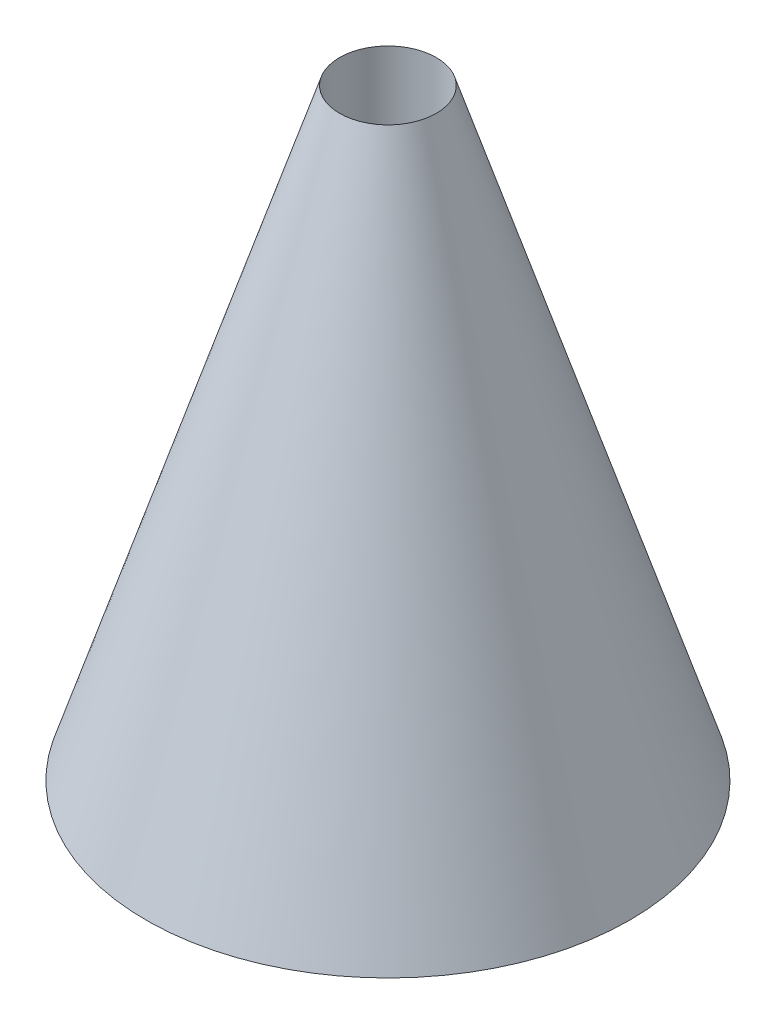
ISO-10303-21;
HEADER;
FILE_DESCRIPTION(('STEP AP214'),'2;1');
FILE_NAME('part.step','',(''),(''),'','','');
FILE_SCHEMA(('AUTOMOTIVE_DESIGN { 1 0 10303 214 1 1 1 1 }'));
ENDSEC;
DATA;
#1=APPLICATION_CONTEXT('core data for automotive mechanical design processes');
#2=APPLICATION_PROTOCOL_DEFINITION('international standard','automotive_design',2000,#1);
#3=PRODUCT_CONTEXT('',#1,'mechanical');
#4=PRODUCT('Part','Part','',(#3));
#5=PRODUCT_RELATED_PRODUCT_CATEGORY('part','',(#4));
#6=PRODUCT_DEFINITION_FORMATION('','',#4);
#7=PRODUCT_DEFINITION_CONTEXT('part definition',#1,'design');
#8=PRODUCT_DEFINITION('design','',#6,#7);
#9=PRODUCT_DEFINITION_SHAPE('','',#8);
#10=(LENGTH_UNIT() NAMED_UNIT(*) SI_UNIT(.MILLI.,.METRE.));
#11=(NAMED_UNIT(*) PLANE_ANGLE_UNIT() SI_UNIT($,.RADIAN.));
#12=(NAMED_UNIT(*) SI_UNIT($,.STERADIAN.) SOLID_ANGLE_UNIT());
#13=UNCERTAINTY_MEASURE_WITH_UNIT(LENGTH_MEASURE(1.E-05),#10,'distance_accuracy_value','');
#14=(GEOMETRIC_REPRESENTATION_CONTEXT(3) GLOBAL_UNCERTAINTY_ASSIGNED_CONTEXT((#13)) GLOBAL_UNIT_ASSIGNED_CONTEXT((#10,
#11,#12)) REPRESENTATION_CONTEXT('',''));
#15=CARTESIAN_POINT('',(0.,0.,0.));
#16=DIRECTION('',(0.,0.,1.));
#17=DIRECTION('',(1.,0.,0.));
#18=AXIS2_PLACEMENT_3D('',#15,#16,#17);
#19=CARTESIAN_POINT('',(0.,0.,0.));
#20=DIRECTION('',(0.,1.,0.));
#21=DIRECTION('',(-1.,0.,0.));
#22=AXIS2_PLACEMENT_3D('',#19,#20,#21);
#23=PLANE('',#22);
#24=CARTESIAN_POINT('',(0.,0.,0.));
#25=DIRECTION('',(0.,1.,0.));
#26=DIRECTION('',(-1.,0.,0.));
#27=AXIS2_PLACEMENT_3D('',#24,#25,#26);
#28=CIRCLE('',#27,2.54);
#29=CARTESIAN_POINT('',(-2.54,0.,0.));
#30=VERTEX_POINT('',#29);
#31=EDGE_CURVE('E43',#30,#30,#28,.T.);
#32=ORIENTED_EDGE('',*,*,#31,.T.);
#33=EDGE_LOOP('',(#32));
#34=FACE_BOUND('',#33,.T.);
#35=CARTESIAN_POINT('',(0.,0.,0.));
#36=DIRECTION('',(0.,1.,0.));
#37=DIRECTION('',(-1.,0.,0.));
#38=AXIS2_PLACEMENT_3D('',#35,#36,#37);
#39=CIRCLE('',#38,12.7);
#40=CARTESIAN_POINT('',(12.7,0.,0.));
#41=VERTEX_POINT('',#40);
#42=EDGE_CURVE('E10',#41,#41,#39,.T.);
#43=ORIENTED_EDGE('',*,*,#42,.F.);
#44=EDGE_LOOP('',(#43));
#45=FACE_BOUND('',#44,.T.);
#46=ADVANCED_FACE('F33',(#34,#45),#23,.F.);
#47=CARTESIAN_POINT('',(0.,0.,0.));
#48=DIRECTION('',(0.,-1.,0.));
#49=DIRECTION('',(1.,0.,0.));
#50=AXIS2_PLACEMENT_3D('',#47,#48,#49);
#51=CONICAL_SURFACE('',#50,12.7,0.310998280605541);
#52=CARTESIAN_POINT('',(0.,31.6088888888889,0.));
#53=DIRECTION('',(0.,-1.,0.));
#54=DIRECTION('',(1.,0.,0.));
#55=AXIS2_PLACEMENT_3D('',#52,#53,#54);
#56=CIRCLE('',#55,2.54);
#57=CARTESIAN_POINT('',(2.54,31.6088888888889,0.));
#58=VERTEX_POINT('',#57);
#59=EDGE_CURVE('E36',#58,#58,#56,.T.);
#60=CARTESIAN_POINT('',(2.54,31.6088888888889,0.));
#61=CARTESIAN_POINT('',(2.64583333333334,31.2796296296296,0.));
#62=CARTESIAN_POINT('',(2.75166666666667,30.9503703703704,0.));
#63=CARTESIAN_POINT('',(2.96333333333334,30.2918518518518,0.));
#64=CARTESIAN_POINT('',(3.06916666666667,29.9625925925926,0.));
#65=CARTESIAN_POINT('',(3.28083333333334,29.3040740740741,0.));
#66=CARTESIAN_POINT('',(3.38666666666667,28.9748148148148,0.));
#67=CARTESIAN_POINT('',(3.59833333333334,28.3162962962963,0.));
#68=CARTESIAN_POINT('',(3.70416666666667,27.987037037037,0.));
#69=CARTESIAN_POINT('',(3.91583333333334,27.3285185185185,0.));
#70=CARTESIAN_POINT('',(4.02166666666667,26.9992592592593,0.));
#71=CARTESIAN_POINT('',(4.23333333333334,26.3407407407407,0.));
#72=CARTESIAN_POINT('',(4.33916666666667,26.0114814814815,0.));
#73=CARTESIAN_POINT('',(4.55083333333334,25.352962962963,0.));
#74=CARTESIAN_POINT('',(4.65666666666667,25.0237037037037,0.));
#75=CARTESIAN_POINT('',(4.86833333333334,24.3651851851852,0.));
#76=CARTESIAN_POINT('',(4.97416666666667,24.0359259259259,0.));
#77=CARTESIAN_POINT('',(5.18583333333333,23.3774074074074,0.));
#78=CARTESIAN_POINT('',(5.29166666666667,23.0481481481481,0.));
#79=CARTESIAN_POINT('',(5.50333333333334,22.3896296296296,0.));
#80=CARTESIAN_POINT('',(5.60916666666667,22.0603703703704,0.));
#81=CARTESIAN_POINT('',(5.82083333333333,21.4018518518518,0.));
#82=CARTESIAN_POINT('',(5.92666666666667,21.0725925925926,0.));
#83=CARTESIAN_POINT('',(6.13833333333334,20.4140740740741,0.));
#84=CARTESIAN_POINT('',(6.24416666666667,20.0848148148148,0.));
#85=CARTESIAN_POINT('',(6.45583333333334,19.4262962962963,0.));
#86=CARTESIAN_POINT('',(6.56166666666667,19.097037037037,0.));
#87=CARTESIAN_POINT('',(6.77333333333333,18.4385185185185,0.));
#88=CARTESIAN_POINT('',(6.87916666666667,18.1092592592593,0.));
#89=CARTESIAN_POINT('',(7.09083333333333,17.4507407407407,0.));
#90=CARTESIAN_POINT('',(7.19666666666667,17.1214814814815,0.));
#91=CARTESIAN_POINT('',(7.40833333333333,16.462962962963,0.));
#92=CARTESIAN_POINT('',(7.51416666666667,16.1337037037037,0.));
#93=CARTESIAN_POINT('',(7.72583333333333,15.4751851851852,0.));
#94=CARTESIAN_POINT('',(7.83166666666667,15.1459259259259,0.));
#95=CARTESIAN_POINT('',(8.04333333333333,14.4874074074074,0.));
#96=CARTESIAN_POINT('',(8.14916666666667,14.1581481481481,0.));
#97=CARTESIAN_POINT('',(8.36083333333334,13.4996296296296,0.));
#98=CARTESIAN_POINT('',(8.46666666666667,13.1703703703704,0.));
#99=CARTESIAN_POINT('',(8.67833333333333,12.5118518518518,0.));
#100=CARTESIAN_POINT('',(8.78416666666667,12.1825925925926,0.));
#101=CARTESIAN_POINT('',(8.99583333333333,11.5240740740741,0.));
#102=CARTESIAN_POINT('',(9.10166666666667,11.1948148148148,0.));
#103=CARTESIAN_POINT('',(9.31333333333333,10.5362962962963,0.));
#104=CARTESIAN_POINT('',(9.41916666666667,10.207037037037,0.));
#105=CARTESIAN_POINT('',(9.63083333333333,9.54851851851852,0.));
#106=CARTESIAN_POINT('',(9.73666666666667,9.21925925925926,0.));
#107=CARTESIAN_POINT('',(9.94833333333333,8.56074074074074,0.));
#108=CARTESIAN_POINT('',(10.0541666666667,8.23148148148148,0.));
#109=CARTESIAN_POINT('',(10.2658333333333,7.57296296296296,0.));
#110=CARTESIAN_POINT('',(10.3716666666667,7.2437037037037,0.));
#111=CARTESIAN_POINT('',(10.5833333333333,6.58518518518518,0.));
#112=CARTESIAN_POINT('',(10.6891666666667,6.25592592592592,0.));
#113=CARTESIAN_POINT('',(10.9008333333333,5.59740740740741,0.));
#114=CARTESIAN_POINT('',(11.0066666666667,5.26814814814815,0.));
#115=CARTESIAN_POINT('',(11.2183333333333,4.60962962962963,0.));
#116=CARTESIAN_POINT('',(11.3241666666667,4.28037037037037,0.));
#117=CARTESIAN_POINT('',(11.5358333333333,3.62185185185185,0.));
#118=CARTESIAN_POINT('',(11.6416666666667,3.29259259259259,0.));
#119=CARTESIAN_POINT('',(11.8533333333333,2.63407407407407,0.));
#120=CARTESIAN_POINT('',(11.9591666666667,2.30481481481482,0.));
#121=CARTESIAN_POINT('',(12.1708333333333,1.6462962962963,0.));
#122=CARTESIAN_POINT('',(12.2766666666667,1.31703703703704,0.));
#123=CARTESIAN_POINT('',(12.4883333333333,0.658518518518519,0.));
#124=CARTESIAN_POINT('',(12.5941666666667,0.32925925925926,0.));
#125=CARTESIAN_POINT('',(12.7,0.,0.));
#126=B_SPLINE_CURVE_WITH_KNOTS('',3,(#60,#61,#62,#63,#64,#65,#66,#67,#68,#69,#70,#71,#72,#73,
#74,#75,#76,#77,#78,#79,#80,#81,#82,#83,#84,#85,#86,#87,#88,#89,#90,#91,#92,#93,#94,#95,#96,#97,
#98,#99,#100,#101,#102,#103,#104,#105,#106,#107,#108,#109,#110,#111,#112,#113,#114,#115,#116,
#117,#118,#119,#120,#121,#122,#123,#124,#125),.UNSPECIFIED.,.F.,.F.,(4,2,2,2,2,2,2,2,2,2,2,2,2,
2,2,2,2,2,2,2,2,2,2,2,2,2,2,2,2,2,2,2,4),(0.,1.0375505714285,2.075101142857,3.1126517142855,
4.150202285714,5.18775285714249,6.22530342857099,7.26285399999949,8.30040457142799,
9.33795514285649,10.375505714285,11.4130562857135,12.450606857142,13.4881574285705,
14.525707999999,15.5632585714275,16.600809142856,17.6383597142845,18.675910285713,
19.7134608571415,20.75101142857,21.7885619999985,22.826112571427,23.8636631428555,
24.901213714284,25.9387642857125,26.976314857141,28.0138654285695,29.051415999998,
30.0889665714265,31.126517142855,32.1640677142835,33.201618285712),.UNSPECIFIED.);
#127=EDGE_CURVE('BSEAM53',#58,#41,#126,.T.);
#128=ORIENTED_EDGE('',*,*,#59,.T.);
#129=ORIENTED_EDGE('',*,*,#42,.T.);
#130=ORIENTED_EDGE('',*,*,#127,.T.);
#131=ORIENTED_EDGE('',*,*,#127,.F.);
#132=EDGE_LOOP('',(#128,#130,#129,#131));
#133=FACE_BOUND('',#132,.T.);
#134=ADVANCED_FACE('F53',(#133),#51,.T.);
#135=CARTESIAN_POINT('',(0.,0.,0.));
#136=DIRECTION('',(0.,1.,0.));
#137=DIRECTION('',(-1.,0.,0.));
#138=AXIS2_PLACEMENT_3D('',#135,#136,#137);
#139=CYLINDRICAL_SURFACE('',#138,2.54);
#140=ORIENTED_EDGE('',*,*,#31,.F.);
#141=EDGE_LOOP('',(#140));
#142=FACE_BOUND('',#141,.T.);
#143=ORIENTED_EDGE('',*,*,#59,.F.);
#144=EDGE_LOOP('',(#143));
#145=FACE_BOUND('',#144,.T.);
#146=ADVANCED_FACE('F50',(#142,#145),#139,.F.);
#147=CLOSED_SHELL('',(#46,#134,#146));
#148=MANIFOLD_SOLID_BREP('B2',#147);
#149=ADVANCED_BREP_SHAPE_REPRESENTATION('',(#18,#148),#14);
#150=SHAPE_DEFINITION_REPRESENTATION(#9,#149);
ENDSEC;
END-ISO-10303-21;
